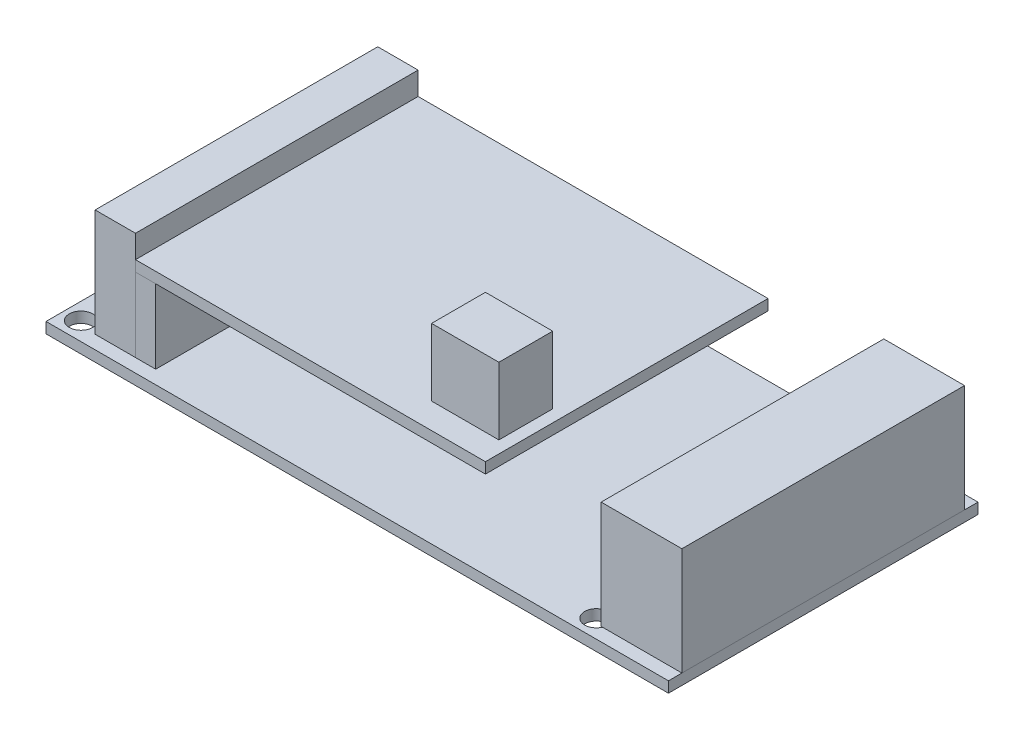
ISO-10303-21;
HEADER;
FILE_DESCRIPTION(('STEP AP214'),'2;1');
FILE_NAME('part.step','',(''),(''),'','','');
FILE_SCHEMA(('AUTOMOTIVE_DESIGN { 1 0 10303 214 1 1 1 1 }'));
ENDSEC;
DATA;
#1=APPLICATION_CONTEXT('core data for automotive mechanical design processes');
#2=APPLICATION_PROTOCOL_DEFINITION('international standard','automotive_design',2000,#1);
#3=PRODUCT_CONTEXT('',#1,'mechanical');
#4=PRODUCT('Part','Part','',(#3));
#5=PRODUCT_RELATED_PRODUCT_CATEGORY('part','',(#4));
#6=PRODUCT_DEFINITION_FORMATION('','',#4);
#7=PRODUCT_DEFINITION_CONTEXT('part definition',#1,'design');
#8=PRODUCT_DEFINITION('design','',#6,#7);
#9=PRODUCT_DEFINITION_SHAPE('','',#8);
#10=(LENGTH_UNIT() NAMED_UNIT(*) SI_UNIT(.MILLI.,.METRE.));
#11=(NAMED_UNIT(*) PLANE_ANGLE_UNIT() SI_UNIT($,.RADIAN.));
#12=(NAMED_UNIT(*) SI_UNIT($,.STERADIAN.) SOLID_ANGLE_UNIT());
#13=UNCERTAINTY_MEASURE_WITH_UNIT(LENGTH_MEASURE(1.E-05),#10,'distance_accuracy_value','');
#14=(GEOMETRIC_REPRESENTATION_CONTEXT(3) GLOBAL_UNCERTAINTY_ASSIGNED_CONTEXT((#13)) GLOBAL_UNIT_ASSIGNED_CONTEXT((#10,
#11,#12)) REPRESENTATION_CONTEXT('',''));
#15=CARTESIAN_POINT('',(0.,0.,0.));
#16=DIRECTION('',(0.,0.,1.));
#17=DIRECTION('',(1.,0.,0.));
#18=AXIS2_PLACEMENT_3D('',#15,#16,#17);
#19=CARTESIAN_POINT('',(5.25000000000003,24.2,9.2));
#20=DIRECTION('',(1.,0.,0.));
#21=DIRECTION('',(0.,0.,-1.));
#22=AXIS2_PLACEMENT_3D('',#19,#20,#21);
#23=PLANE('',#22);
#24=DIRECTION('',(0.,0.,1.));
#25=VECTOR('',#24,1.);
#26=CARTESIAN_POINT('',(5.25000000000003,14.2,9.2));
#27=LINE('',#26,#25);
#28=CARTESIAN_POINT('',(5.25000000000003,14.2,9.2));
#29=VERTEX_POINT('',#28);
#30=CARTESIAN_POINT('',(5.25000000000003,14.2,17.2));
#31=VERTEX_POINT('',#30);
#32=EDGE_CURVE('E113',#29,#31,#27,.T.);
#33=ORIENTED_EDGE('',*,*,#32,.T.);
#34=DIRECTION('',(0.,-1.,0.));
#35=VECTOR('',#34,1.);
#36=CARTESIAN_POINT('',(5.25000000000003,24.2,17.2));
#37=LINE('',#36,#35);
#38=CARTESIAN_POINT('',(5.25000000000003,24.2,17.2));
#39=VERTEX_POINT('',#38);
#40=EDGE_CURVE('E12',#39,#31,#37,.T.);
#41=ORIENTED_EDGE('',*,*,#40,.F.);
#42=DIRECTION('',(0.,0.,1.));
#43=VECTOR('',#42,1.);
#44=CARTESIAN_POINT('',(5.25000000000003,24.2,9.2));
#45=LINE('',#44,#43);
#46=CARTESIAN_POINT('',(5.25000000000003,24.2,9.2));
#47=VERTEX_POINT('',#46);
#48=EDGE_CURVE('E101',#47,#39,#45,.T.);
#49=ORIENTED_EDGE('',*,*,#48,.F.);
#50=DIRECTION('',(0.,-1.,0.));
#51=VECTOR('',#50,1.);
#52=CARTESIAN_POINT('',(5.25000000000003,24.2,9.2));
#53=LINE('',#52,#51);
#54=EDGE_CURVE('E109',#47,#29,#53,.T.);
#55=ORIENTED_EDGE('',*,*,#54,.T.);
#56=EDGE_LOOP('',(#33,#41,#49,#55));
#57=FACE_BOUND('',#56,.T.);
#58=ADVANCED_FACE('F50',(#57),#23,.F.);
#59=CARTESIAN_POINT('',(5.25000000000003,24.2,17.2));
#60=DIRECTION('',(0.,0.,-1.));
#61=DIRECTION('',(-1.,0.,0.));
#62=AXIS2_PLACEMENT_3D('',#59,#60,#61);
#63=PLANE('',#62);
#64=DIRECTION('',(1.,0.,0.));
#65=VECTOR('',#64,1.);
#66=CARTESIAN_POINT('',(5.25000000000003,14.2,17.2));
#67=LINE('',#66,#65);
#68=CARTESIAN_POINT('',(15.25,14.2,17.2));
#69=VERTEX_POINT('',#68);
#70=EDGE_CURVE('E105',#31,#69,#67,.T.);
#71=ORIENTED_EDGE('',*,*,#70,.T.);
#72=DIRECTION('',(0.,-1.,0.));
#73=VECTOR('',#72,1.);
#74=CARTESIAN_POINT('',(15.25,24.2,17.2));
#75=LINE('',#74,#73);
#76=CARTESIAN_POINT('',(15.25,24.2,17.2));
#77=VERTEX_POINT('',#76);
#78=EDGE_CURVE('E58',#77,#69,#75,.T.);
#79=ORIENTED_EDGE('',*,*,#78,.F.);
#80=DIRECTION('',(1.,0.,0.));
#81=VECTOR('',#80,1.);
#82=CARTESIAN_POINT('',(5.25000000000003,24.2,17.2));
#83=LINE('',#82,#81);
#84=EDGE_CURVE('E96',#39,#77,#83,.T.);
#85=ORIENTED_EDGE('',*,*,#84,.F.);
#86=ORIENTED_EDGE('',*,*,#40,.T.);
#87=EDGE_LOOP('',(#71,#79,#85,#86));
#88=FACE_BOUND('',#87,.T.);
#89=ADVANCED_FACE('F104',(#88),#63,.F.);
#90=CARTESIAN_POINT('',(15.25,24.2,9.2));
#91=DIRECTION('',(-1.,0.,0.));
#92=DIRECTION('',(0.,0.,1.));
#93=AXIS2_PLACEMENT_3D('',#90,#91,#92);
#94=PLANE('',#93);
#95=DIRECTION('',(0.,0.,-1.));
#96=VECTOR('',#95,1.);
#97=CARTESIAN_POINT('',(15.25,14.2,9.2));
#98=LINE('',#97,#96);
#99=CARTESIAN_POINT('',(15.25,14.2,9.2));
#100=VERTEX_POINT('',#99);
#101=EDGE_CURVE('E83',#69,#100,#98,.T.);
#102=ORIENTED_EDGE('',*,*,#101,.T.);
#103=DIRECTION('',(0.,-1.,0.));
#104=VECTOR('',#103,1.);
#105=CARTESIAN_POINT('',(15.25,24.2,9.2));
#106=LINE('',#105,#104);
#107=CARTESIAN_POINT('',(15.25,24.2,9.2));
#108=VERTEX_POINT('',#107);
#109=EDGE_CURVE('E106',#108,#100,#106,.T.);
#110=ORIENTED_EDGE('',*,*,#109,.F.);
#111=DIRECTION('',(0.,0.,-1.));
#112=VECTOR('',#111,1.);
#113=CARTESIAN_POINT('',(15.25,24.2,9.2));
#114=LINE('',#113,#112);
#115=EDGE_CURVE('E99',#77,#108,#114,.T.);
#116=ORIENTED_EDGE('',*,*,#115,.F.);
#117=ORIENTED_EDGE('',*,*,#78,.T.);
#118=EDGE_LOOP('',(#102,#110,#116,#117));
#119=FACE_BOUND('',#118,.T.);
#120=ADVANCED_FACE('F107',(#119),#94,.F.);
#121=CARTESIAN_POINT('',(5.25000000000003,24.2,9.2));
#122=DIRECTION('',(0.,0.,1.));
#123=DIRECTION('',(1.,0.,0.));
#124=AXIS2_PLACEMENT_3D('',#121,#122,#123);
#125=PLANE('',#124);
#126=DIRECTION('',(-1.,0.,0.));
#127=VECTOR('',#126,1.);
#128=CARTESIAN_POINT('',(5.25000000000003,14.2,9.2));
#129=LINE('',#128,#127);
#130=EDGE_CURVE('E89',#100,#29,#129,.T.);
#131=ORIENTED_EDGE('',*,*,#130,.T.);
#132=ORIENTED_EDGE('',*,*,#54,.F.);
#133=DIRECTION('',(-1.,0.,0.));
#134=VECTOR('',#133,1.);
#135=CARTESIAN_POINT('',(5.25000000000003,24.2,9.2));
#136=LINE('',#135,#134);
#137=EDGE_CURVE('E66',#108,#47,#136,.T.);
#138=ORIENTED_EDGE('',*,*,#137,.F.);
#139=ORIENTED_EDGE('',*,*,#109,.T.);
#140=EDGE_LOOP('',(#131,#132,#138,#139));
#141=FACE_BOUND('',#140,.T.);
#142=ADVANCED_FACE('F120',(#141),#125,.F.);
#143=CARTESIAN_POINT('',(0.,24.2,0.));
#144=DIRECTION('',(0.,1.,0.));
#145=DIRECTION('',(0.,0.,1.));
#146=AXIS2_PLACEMENT_3D('',#143,#144,#145);
#147=PLANE('',#146);
#148=ORIENTED_EDGE('',*,*,#48,.T.);
#149=ORIENTED_EDGE('',*,*,#84,.T.);
#150=ORIENTED_EDGE('',*,*,#115,.T.);
#151=ORIENTED_EDGE('',*,*,#137,.T.);
#152=EDGE_LOOP('',(#148,#149,#150,#151));
#153=FACE_BOUND('',#152,.T.);
#154=ADVANCED_FACE('F97',(#153),#147,.T.);
#155=CARTESIAN_POINT('',(0.,14.2,0.));
#156=DIRECTION('',(0.,1.,0.));
#157=DIRECTION('',(0.,0.,1.));
#158=AXIS2_PLACEMENT_3D('',#155,#156,#157);
#159=PLANE('',#158);
#160=ORIENTED_EDGE('',*,*,#32,.F.);
#161=ORIENTED_EDGE('',*,*,#130,.F.);
#162=ORIENTED_EDGE('',*,*,#101,.F.);
#163=ORIENTED_EDGE('',*,*,#70,.F.);
#164=EDGE_LOOP('',(#160,#161,#162,#163));
#165=FACE_BOUND('',#164,.T.);
#166=ADVANCED_FACE('F123',(#165),#159,.F.);
#167=CLOSED_SHELL('',(#58,#89,#120,#142,#154,#166));
#168=MANIFOLD_SOLID_BREP('B2',#167);
#169=CARTESIAN_POINT('',(-34.95,14.2,-21.));
#170=DIRECTION('',(1.,0.,0.));
#171=DIRECTION('',(0.,0.,-1.));
#172=AXIS2_PLACEMENT_3D('',#169,#170,#171);
#173=PLANE('',#172);
#174=DIRECTION('',(0.,0.,1.));
#175=VECTOR('',#174,1.);
#176=CARTESIAN_POINT('',(-34.95,12.6,-21.));
#177=LINE('',#176,#175);
#178=CARTESIAN_POINT('',(-34.95,12.6,-21.));
#179=VERTEX_POINT('',#178);
#180=CARTESIAN_POINT('',(-34.95,12.6,21.));
#181=VERTEX_POINT('',#180);
#182=EDGE_CURVE('E247',#179,#181,#177,.T.);
#183=ORIENTED_EDGE('',*,*,#182,.T.);
#184=DIRECTION('',(0.,-1.,0.));
#185=VECTOR('',#184,1.);
#186=CARTESIAN_POINT('',(-34.95,14.2,21.));
#187=LINE('',#186,#185);
#188=CARTESIAN_POINT('',(-34.95,14.2,21.));
#189=VERTEX_POINT('',#188);
#190=EDGE_CURVE('E48',#189,#181,#187,.T.);
#191=ORIENTED_EDGE('',*,*,#190,.F.);
#192=DIRECTION('',(0.,0.,1.));
#193=VECTOR('',#192,1.);
#194=CARTESIAN_POINT('',(-34.95,14.2,-21.));
#195=LINE('',#194,#193);
#196=CARTESIAN_POINT('',(-34.95,14.2,-21.));
#197=VERTEX_POINT('',#196);
#198=EDGE_CURVE('E235',#197,#189,#195,.T.);
#199=ORIENTED_EDGE('',*,*,#198,.F.);
#200=DIRECTION('',(0.,-1.,0.));
#201=VECTOR('',#200,1.);
#202=CARTESIAN_POINT('',(-34.95,14.2,-21.));
#203=LINE('',#202,#201);
#204=EDGE_CURVE('E243',#197,#179,#203,.T.);
#205=ORIENTED_EDGE('',*,*,#204,.T.);
#206=EDGE_LOOP('',(#183,#191,#199,#205));
#207=FACE_BOUND('',#206,.T.);
#208=ADVANCED_FACE('F184',(#207),#173,.F.);
#209=CARTESIAN_POINT('',(-34.95,14.2,21.));
#210=DIRECTION('',(0.,0.,-1.));
#211=DIRECTION('',(-1.,0.,0.));
#212=AXIS2_PLACEMENT_3D('',#209,#210,#211);
#213=PLANE('',#212);
#214=DIRECTION('',(1.,0.,0.));
#215=VECTOR('',#214,1.);
#216=CARTESIAN_POINT('',(-34.95,12.6,21.));
#217=LINE('',#216,#215);
#218=CARTESIAN_POINT('',(17.05,12.6,21.));
#219=VERTEX_POINT('',#218);
#220=EDGE_CURVE('E239',#181,#219,#217,.T.);
#221=ORIENTED_EDGE('',*,*,#220,.T.);
#222=DIRECTION('',(0.,-1.,0.));
#223=VECTOR('',#222,1.);
#224=CARTESIAN_POINT('',(17.05,14.2,21.));
#225=LINE('',#224,#223);
#226=CARTESIAN_POINT('',(17.05,14.2,21.));
#227=VERTEX_POINT('',#226);
#228=EDGE_CURVE('E192',#227,#219,#225,.T.);
#229=ORIENTED_EDGE('',*,*,#228,.F.);
#230=DIRECTION('',(1.,0.,0.));
#231=VECTOR('',#230,1.);
#232=CARTESIAN_POINT('',(-34.95,14.2,21.));
#233=LINE('',#232,#231);
#234=EDGE_CURVE('E230',#189,#227,#233,.T.);
#235=ORIENTED_EDGE('',*,*,#234,.F.);
#236=ORIENTED_EDGE('',*,*,#190,.T.);
#237=EDGE_LOOP('',(#221,#229,#235,#236));
#238=FACE_BOUND('',#237,.T.);
#239=ADVANCED_FACE('F238',(#238),#213,.F.);
#240=CARTESIAN_POINT('',(17.05,14.2,-21.));
#241=DIRECTION('',(-1.,0.,0.));
#242=DIRECTION('',(0.,0.,1.));
#243=AXIS2_PLACEMENT_3D('',#240,#241,#242);
#244=PLANE('',#243);
#245=DIRECTION('',(0.,0.,-1.));
#246=VECTOR('',#245,1.);
#247=CARTESIAN_POINT('',(17.05,12.6,-21.));
#248=LINE('',#247,#246);
#249=CARTESIAN_POINT('',(17.05,12.6,-21.));
#250=VERTEX_POINT('',#249);
#251=EDGE_CURVE('E217',#219,#250,#248,.T.);
#252=ORIENTED_EDGE('',*,*,#251,.T.);
#253=DIRECTION('',(0.,-1.,0.));
#254=VECTOR('',#253,1.);
#255=CARTESIAN_POINT('',(17.05,14.2,-21.));
#256=LINE('',#255,#254);
#257=CARTESIAN_POINT('',(17.05,14.2,-21.));
#258=VERTEX_POINT('',#257);
#259=EDGE_CURVE('E240',#258,#250,#256,.T.);
#260=ORIENTED_EDGE('',*,*,#259,.F.);
#261=DIRECTION('',(0.,0.,-1.));
#262=VECTOR('',#261,1.);
#263=CARTESIAN_POINT('',(17.05,14.2,-21.));
#264=LINE('',#263,#262);
#265=EDGE_CURVE('E233',#227,#258,#264,.T.);
#266=ORIENTED_EDGE('',*,*,#265,.F.);
#267=ORIENTED_EDGE('',*,*,#228,.T.);
#268=EDGE_LOOP('',(#252,#260,#266,#267));
#269=FACE_BOUND('',#268,.T.);
#270=ADVANCED_FACE('F241',(#269),#244,.F.);
#271=CARTESIAN_POINT('',(-34.95,14.2,-21.));
#272=DIRECTION('',(0.,0.,1.));
#273=DIRECTION('',(1.,0.,0.));
#274=AXIS2_PLACEMENT_3D('',#271,#272,#273);
#275=PLANE('',#274);
#276=DIRECTION('',(-1.,0.,0.));
#277=VECTOR('',#276,1.);
#278=CARTESIAN_POINT('',(-34.95,12.6,-21.));
#279=LINE('',#278,#277);
#280=EDGE_CURVE('E223',#250,#179,#279,.T.);
#281=ORIENTED_EDGE('',*,*,#280,.T.);
#282=ORIENTED_EDGE('',*,*,#204,.F.);
#283=DIRECTION('',(-1.,0.,0.));
#284=VECTOR('',#283,1.);
#285=CARTESIAN_POINT('',(-34.95,14.2,-21.));
#286=LINE('',#285,#284);
#287=EDGE_CURVE('E200',#258,#197,#286,.T.);
#288=ORIENTED_EDGE('',*,*,#287,.F.);
#289=ORIENTED_EDGE('',*,*,#259,.T.);
#290=EDGE_LOOP('',(#281,#282,#288,#289));
#291=FACE_BOUND('',#290,.T.);
#292=ADVANCED_FACE('F254',(#291),#275,.F.);
#293=CARTESIAN_POINT('',(0.,14.2,0.));
#294=DIRECTION('',(0.,1.,0.));
#295=DIRECTION('',(0.,0.,1.));
#296=AXIS2_PLACEMENT_3D('',#293,#294,#295);
#297=PLANE('',#296);
#298=ORIENTED_EDGE('',*,*,#198,.T.);
#299=ORIENTED_EDGE('',*,*,#234,.T.);
#300=ORIENTED_EDGE('',*,*,#265,.T.);
#301=ORIENTED_EDGE('',*,*,#287,.T.);
#302=EDGE_LOOP('',(#298,#299,#300,#301));
#303=FACE_BOUND('',#302,.T.);
#304=ADVANCED_FACE('F231',(#303),#297,.T.);
#305=CARTESIAN_POINT('',(0.,12.6,0.));
#306=DIRECTION('',(0.,1.,0.));
#307=DIRECTION('',(0.,0.,1.));
#308=AXIS2_PLACEMENT_3D('',#305,#306,#307);
#309=PLANE('',#308);
#310=ORIENTED_EDGE('',*,*,#182,.F.);
#311=ORIENTED_EDGE('',*,*,#280,.F.);
#312=ORIENTED_EDGE('',*,*,#251,.F.);
#313=ORIENTED_EDGE('',*,*,#220,.F.);
#314=EDGE_LOOP('',(#310,#311,#312,#313));
#315=FACE_BOUND('',#314,.T.);
#316=ADVANCED_FACE('F257',(#315),#309,.F.);
#317=CLOSED_SHELL('',(#208,#239,#270,#292,#304,#316));
#318=MANIFOLD_SOLID_BREP('B6',#317);
#319=CARTESIAN_POINT('',(-34.95,12.6,21.));
#320=DIRECTION('',(1.,0.,0.));
#321=DIRECTION('',(0.,0.,-1.));
#322=AXIS2_PLACEMENT_3D('',#319,#320,#321);
#323=PLANE('',#322);
#324=DIRECTION('',(0.,0.,1.));
#325=VECTOR('',#324,1.);
#326=CARTESIAN_POINT('',(-34.95,1.6,21.));
#327=LINE('',#326,#325);
#328=CARTESIAN_POINT('',(-34.95,1.6,-21.));
#329=VERTEX_POINT('',#328);
#330=CARTESIAN_POINT('',(-34.95,1.6,21.));
#331=VERTEX_POINT('',#330);
#332=EDGE_CURVE('E381',#329,#331,#327,.T.);
#333=ORIENTED_EDGE('',*,*,#332,.T.);
#334=DIRECTION('',(0.,-1.,0.));
#335=VECTOR('',#334,1.);
#336=CARTESIAN_POINT('',(-34.95,12.6,21.));
#337=LINE('',#336,#335);
#338=CARTESIAN_POINT('',(-34.95,12.6,21.));
#339=VERTEX_POINT('',#338);
#340=EDGE_CURVE('E182',#339,#331,#337,.T.);
#341=ORIENTED_EDGE('',*,*,#340,.F.);
#342=DIRECTION('',(0.,0.,1.));
#343=VECTOR('',#342,1.);
#344=CARTESIAN_POINT('',(-34.95,12.6,21.));
#345=LINE('',#344,#343);
#346=CARTESIAN_POINT('',(-34.95,12.6,-21.));
#347=VERTEX_POINT('',#346);
#348=EDGE_CURVE('E369',#347,#339,#345,.T.);
#349=ORIENTED_EDGE('',*,*,#348,.F.);
#350=DIRECTION('',(0.,-1.,0.));
#351=VECTOR('',#350,1.);
#352=CARTESIAN_POINT('',(-34.95,12.6,-21.));
#353=LINE('',#352,#351);
#354=EDGE_CURVE('E377',#347,#329,#353,.T.);
#355=ORIENTED_EDGE('',*,*,#354,.T.);
#356=EDGE_LOOP('',(#333,#341,#349,#355));
#357=FACE_BOUND('',#356,.T.);
#358=ADVANCED_FACE('F318',(#357),#323,.F.);
#359=CARTESIAN_POINT('',(-31.95,12.6,21.));
#360=DIRECTION('',(0.,0.,-1.));
#361=DIRECTION('',(-1.,0.,0.));
#362=AXIS2_PLACEMENT_3D('',#359,#360,#361);
#363=PLANE('',#362);
#364=DIRECTION('',(1.,0.,0.));
#365=VECTOR('',#364,1.);
#366=CARTESIAN_POINT('',(-31.95,1.6,21.));
#367=LINE('',#366,#365);
#368=CARTESIAN_POINT('',(-31.95,1.6,21.));
#369=VERTEX_POINT('',#368);
#370=EDGE_CURVE('E373',#331,#369,#367,.T.);
#371=ORIENTED_EDGE('',*,*,#370,.T.);
#372=DIRECTION('',(0.,-1.,0.));
#373=VECTOR('',#372,1.);
#374=CARTESIAN_POINT('',(-31.95,12.6,21.));
#375=LINE('',#374,#373);
#376=CARTESIAN_POINT('',(-31.95,12.6,21.));
#377=VERTEX_POINT('',#376);
#378=EDGE_CURVE('E326',#377,#369,#375,.T.);
#379=ORIENTED_EDGE('',*,*,#378,.F.);
#380=DIRECTION('',(1.,0.,0.));
#381=VECTOR('',#380,1.);
#382=CARTESIAN_POINT('',(-31.95,12.6,21.));
#383=LINE('',#382,#381);
#384=EDGE_CURVE('E364',#339,#377,#383,.T.);
#385=ORIENTED_EDGE('',*,*,#384,.F.);
#386=ORIENTED_EDGE('',*,*,#340,.T.);
#387=EDGE_LOOP('',(#371,#379,#385,#386));
#388=FACE_BOUND('',#387,.T.);
#389=ADVANCED_FACE('F372',(#388),#363,.F.);
#390=CARTESIAN_POINT('',(-31.95,12.6,21.));
#391=DIRECTION('',(-1.,0.,0.));
#392=DIRECTION('',(0.,0.,1.));
#393=AXIS2_PLACEMENT_3D('',#390,#391,#392);
#394=PLANE('',#393);
#395=DIRECTION('',(0.,0.,-1.));
#396=VECTOR('',#395,1.);
#397=CARTESIAN_POINT('',(-31.95,1.6,21.));
#398=LINE('',#397,#396);
#399=CARTESIAN_POINT('',(-31.95,1.6,-21.));
#400=VERTEX_POINT('',#399);
#401=EDGE_CURVE('E351',#369,#400,#398,.T.);
#402=ORIENTED_EDGE('',*,*,#401,.T.);
#403=DIRECTION('',(0.,-1.,0.));
#404=VECTOR('',#403,1.);
#405=CARTESIAN_POINT('',(-31.95,12.6,-21.));
#406=LINE('',#405,#404);
#407=CARTESIAN_POINT('',(-31.95,12.6,-21.));
#408=VERTEX_POINT('',#407);
#409=EDGE_CURVE('E374',#408,#400,#406,.T.);
#410=ORIENTED_EDGE('',*,*,#409,.F.);
#411=DIRECTION('',(0.,0.,-1.));
#412=VECTOR('',#411,1.);
#413=CARTESIAN_POINT('',(-31.95,12.6,21.));
#414=LINE('',#413,#412);
#415=EDGE_CURVE('E367',#377,#408,#414,.T.);
#416=ORIENTED_EDGE('',*,*,#415,.F.);
#417=ORIENTED_EDGE('',*,*,#378,.T.);
#418=EDGE_LOOP('',(#402,#410,#416,#417));
#419=FACE_BOUND('',#418,.T.);
#420=ADVANCED_FACE('F375',(#419),#394,.F.);
#421=CARTESIAN_POINT('',(-31.95,12.6,-21.));
#422=DIRECTION('',(0.,0.,1.));
#423=DIRECTION('',(1.,0.,0.));
#424=AXIS2_PLACEMENT_3D('',#421,#422,#423);
#425=PLANE('',#424);
#426=DIRECTION('',(-1.,0.,0.));
#427=VECTOR('',#426,1.);
#428=CARTESIAN_POINT('',(-31.95,1.6,-21.));
#429=LINE('',#428,#427);
#430=EDGE_CURVE('E357',#400,#329,#429,.T.);
#431=ORIENTED_EDGE('',*,*,#430,.T.);
#432=ORIENTED_EDGE('',*,*,#354,.F.);
#433=DIRECTION('',(-1.,0.,0.));
#434=VECTOR('',#433,1.);
#435=CARTESIAN_POINT('',(-31.95,12.6,-21.));
#436=LINE('',#435,#434);
#437=EDGE_CURVE('E334',#408,#347,#436,.T.);
#438=ORIENTED_EDGE('',*,*,#437,.F.);
#439=ORIENTED_EDGE('',*,*,#409,.T.);
#440=EDGE_LOOP('',(#431,#432,#438,#439));
#441=FACE_BOUND('',#440,.T.);
#442=ADVANCED_FACE('F388',(#441),#425,.F.);
#443=CARTESIAN_POINT('',(0.,12.6,0.));
#444=DIRECTION('',(0.,1.,0.));
#445=DIRECTION('',(0.,0.,1.));
#446=AXIS2_PLACEMENT_3D('',#443,#444,#445);
#447=PLANE('',#446);
#448=ORIENTED_EDGE('',*,*,#348,.T.);
#449=ORIENTED_EDGE('',*,*,#384,.T.);
#450=ORIENTED_EDGE('',*,*,#415,.T.);
#451=ORIENTED_EDGE('',*,*,#437,.T.);
#452=EDGE_LOOP('',(#448,#449,#450,#451));
#453=FACE_BOUND('',#452,.T.);
#454=ADVANCED_FACE('F365',(#453),#447,.T.);
#455=CARTESIAN_POINT('',(0.,1.6,0.));
#456=DIRECTION('',(0.,1.,0.));
#457=DIRECTION('',(0.,0.,1.));
#458=AXIS2_PLACEMENT_3D('',#455,#456,#457);
#459=PLANE('',#458);
#460=ORIENTED_EDGE('',*,*,#332,.F.);
#461=ORIENTED_EDGE('',*,*,#430,.F.);
#462=ORIENTED_EDGE('',*,*,#401,.F.);
#463=ORIENTED_EDGE('',*,*,#370,.F.);
#464=EDGE_LOOP('',(#460,#461,#462,#463));
#465=FACE_BOUND('',#464,.T.);
#466=ADVANCED_FACE('F391',(#465),#459,.F.);
#467=CLOSED_SHELL('',(#358,#389,#420,#442,#454,#466));
#468=MANIFOLD_SOLID_BREP('B42',#467);
#469=CARTESIAN_POINT('',(46.25,17.6,21.));
#470=DIRECTION('',(-1.,0.,0.));
#471=DIRECTION('',(0.,0.,1.));
#472=AXIS2_PLACEMENT_3D('',#469,#470,#471);
#473=PLANE('',#472);
#474=DIRECTION('',(0.,0.,-1.));
#475=VECTOR('',#474,1.);
#476=CARTESIAN_POINT('',(46.25,1.6,21.));
#477=LINE('',#476,#475);
#478=CARTESIAN_POINT('',(46.25,1.6,21.));
#479=VERTEX_POINT('',#478);
#480=CARTESIAN_POINT('',(46.25,1.6,-21.));
#481=VERTEX_POINT('',#480);
#482=EDGE_CURVE('E515',#479,#481,#477,.T.);
#483=ORIENTED_EDGE('',*,*,#482,.T.);
#484=DIRECTION('',(0.,-1.,0.));
#485=VECTOR('',#484,1.);
#486=CARTESIAN_POINT('',(46.25,17.6,-21.));
#487=LINE('',#486,#485);
#488=CARTESIAN_POINT('',(46.25,17.6,-21.));
#489=VERTEX_POINT('',#488);
#490=EDGE_CURVE('E316',#489,#481,#487,.T.);
#491=ORIENTED_EDGE('',*,*,#490,.F.);
#492=DIRECTION('',(0.,0.,-1.));
#493=VECTOR('',#492,1.);
#494=CARTESIAN_POINT('',(46.25,17.6,21.));
#495=LINE('',#494,#493);
#496=CARTESIAN_POINT('',(46.25,17.6,21.));
#497=VERTEX_POINT('',#496);
#498=EDGE_CURVE('E503',#497,#489,#495,.T.);
#499=ORIENTED_EDGE('',*,*,#498,.F.);
#500=DIRECTION('',(0.,-1.,0.));
#501=VECTOR('',#500,1.);
#502=CARTESIAN_POINT('',(46.25,17.6,21.));
#503=LINE('',#502,#501);
#504=EDGE_CURVE('E511',#497,#479,#503,.T.);
#505=ORIENTED_EDGE('',*,*,#504,.T.);
#506=EDGE_LOOP('',(#483,#491,#499,#505));
#507=FACE_BOUND('',#506,.T.);
#508=ADVANCED_FACE('F452',(#507),#473,.F.);
#509=CARTESIAN_POINT('',(34.25,17.6,-21.));
#510=DIRECTION('',(0.,0.,1.));
#511=DIRECTION('',(1.,0.,0.));
#512=AXIS2_PLACEMENT_3D('',#509,#510,#511);
#513=PLANE('',#512);
#514=DIRECTION('',(-1.,0.,0.));
#515=VECTOR('',#514,1.);
#516=CARTESIAN_POINT('',(34.25,1.6,-21.));
#517=LINE('',#516,#515);
#518=CARTESIAN_POINT('',(34.25,1.6,-21.));
#519=VERTEX_POINT('',#518);
#520=EDGE_CURVE('E507',#481,#519,#517,.T.);
#521=ORIENTED_EDGE('',*,*,#520,.T.);
#522=DIRECTION('',(0.,-1.,0.));
#523=VECTOR('',#522,1.);
#524=CARTESIAN_POINT('',(34.25,17.6,-21.));
#525=LINE('',#524,#523);
#526=CARTESIAN_POINT('',(34.25,17.6,-21.));
#527=VERTEX_POINT('',#526);
#528=EDGE_CURVE('E460',#527,#519,#525,.T.);
#529=ORIENTED_EDGE('',*,*,#528,.F.);
#530=DIRECTION('',(-1.,0.,0.));
#531=VECTOR('',#530,1.);
#532=CARTESIAN_POINT('',(34.25,17.6,-21.));
#533=LINE('',#532,#531);
#534=EDGE_CURVE('E498',#489,#527,#533,.T.);
#535=ORIENTED_EDGE('',*,*,#534,.F.);
#536=ORIENTED_EDGE('',*,*,#490,.T.);
#537=EDGE_LOOP('',(#521,#529,#535,#536));
#538=FACE_BOUND('',#537,.T.);
#539=ADVANCED_FACE('F506',(#538),#513,.F.);
#540=CARTESIAN_POINT('',(34.25,17.6,21.));
#541=DIRECTION('',(1.,0.,0.));
#542=DIRECTION('',(0.,0.,-1.));
#543=AXIS2_PLACEMENT_3D('',#540,#541,#542);
#544=PLANE('',#543);
#545=DIRECTION('',(0.,0.,1.));
#546=VECTOR('',#545,1.);
#547=CARTESIAN_POINT('',(34.25,1.6,21.));
#548=LINE('',#547,#546);
#549=CARTESIAN_POINT('',(34.25,1.6,21.));
#550=VERTEX_POINT('',#549);
#551=EDGE_CURVE('E485',#519,#550,#548,.T.);
#552=ORIENTED_EDGE('',*,*,#551,.T.);
#553=DIRECTION('',(0.,-1.,0.));
#554=VECTOR('',#553,1.);
#555=CARTESIAN_POINT('',(34.25,17.6,21.));
#556=LINE('',#555,#554);
#557=CARTESIAN_POINT('',(34.25,17.6,21.));
#558=VERTEX_POINT('',#557);
#559=EDGE_CURVE('E508',#558,#550,#556,.T.);
#560=ORIENTED_EDGE('',*,*,#559,.F.);
#561=DIRECTION('',(0.,0.,1.));
#562=VECTOR('',#561,1.);
#563=CARTESIAN_POINT('',(34.25,17.6,21.));
#564=LINE('',#563,#562);
#565=EDGE_CURVE('E501',#527,#558,#564,.T.);
#566=ORIENTED_EDGE('',*,*,#565,.F.);
#567=ORIENTED_EDGE('',*,*,#528,.T.);
#568=EDGE_LOOP('',(#552,#560,#566,#567));
#569=FACE_BOUND('',#568,.T.);
#570=ADVANCED_FACE('F509',(#569),#544,.F.);
#571=CARTESIAN_POINT('',(34.25,17.6,21.));
#572=DIRECTION('',(0.,0.,-1.));
#573=DIRECTION('',(-1.,0.,0.));
#574=AXIS2_PLACEMENT_3D('',#571,#572,#573);
#575=PLANE('',#574);
#576=DIRECTION('',(1.,0.,0.));
#577=VECTOR('',#576,1.);
#578=CARTESIAN_POINT('',(34.25,1.6,21.));
#579=LINE('',#578,#577);
#580=EDGE_CURVE('E491',#550,#479,#579,.T.);
#581=ORIENTED_EDGE('',*,*,#580,.T.);
#582=ORIENTED_EDGE('',*,*,#504,.F.);
#583=DIRECTION('',(1.,0.,0.));
#584=VECTOR('',#583,1.);
#585=CARTESIAN_POINT('',(34.25,17.6,21.));
#586=LINE('',#585,#584);
#587=EDGE_CURVE('E468',#558,#497,#586,.T.);
#588=ORIENTED_EDGE('',*,*,#587,.F.);
#589=ORIENTED_EDGE('',*,*,#559,.T.);
#590=EDGE_LOOP('',(#581,#582,#588,#589));
#591=FACE_BOUND('',#590,.T.);
#592=ADVANCED_FACE('F522',(#591),#575,.F.);
#593=CARTESIAN_POINT('',(0.,17.6,0.));
#594=DIRECTION('',(0.,-1.,0.));
#595=DIRECTION('',(0.,0.,-1.));
#596=AXIS2_PLACEMENT_3D('',#593,#594,#595);
#597=PLANE('',#596);
#598=ORIENTED_EDGE('',*,*,#498,.T.);
#599=ORIENTED_EDGE('',*,*,#534,.T.);
#600=ORIENTED_EDGE('',*,*,#565,.T.);
#601=ORIENTED_EDGE('',*,*,#587,.T.);
#602=EDGE_LOOP('',(#598,#599,#600,#601));
#603=FACE_BOUND('',#602,.T.);
#604=ADVANCED_FACE('F499',(#603),#597,.F.);
#605=CARTESIAN_POINT('',(0.,1.6,0.));
#606=DIRECTION('',(0.,-1.,0.));
#607=DIRECTION('',(0.,0.,-1.));
#608=AXIS2_PLACEMENT_3D('',#605,#606,#607);
#609=PLANE('',#608);
#610=ORIENTED_EDGE('',*,*,#482,.F.);
#611=ORIENTED_EDGE('',*,*,#580,.F.);
#612=ORIENTED_EDGE('',*,*,#551,.F.);
#613=ORIENTED_EDGE('',*,*,#520,.F.);
#614=EDGE_LOOP('',(#610,#611,#612,#613));
#615=FACE_BOUND('',#614,.T.);
#616=ADVANCED_FACE('F525',(#615),#609,.T.);
#617=CLOSED_SHELL('',(#508,#539,#570,#592,#604,#616));
#618=MANIFOLD_SOLID_BREP('B176',#617);
#619=CARTESIAN_POINT('',(-40.95,17.6,-21.));
#620=DIRECTION('',(1.,0.,0.));
#621=DIRECTION('',(0.,0.,-1.));
#622=AXIS2_PLACEMENT_3D('',#619,#620,#621);
#623=PLANE('',#622);
#624=DIRECTION('',(0.,0.,1.));
#625=VECTOR('',#624,1.);
#626=CARTESIAN_POINT('',(-40.95,1.6,-21.));
#627=LINE('',#626,#625);
#628=CARTESIAN_POINT('',(-40.95,1.6,-21.));
#629=VERTEX_POINT('',#628);
#630=CARTESIAN_POINT('',(-40.95,1.6,21.));
#631=VERTEX_POINT('',#630);
#632=EDGE_CURVE('E648',#629,#631,#627,.T.);
#633=ORIENTED_EDGE('',*,*,#632,.T.);
#634=DIRECTION('',(0.,-1.,0.));
#635=VECTOR('',#634,1.);
#636=CARTESIAN_POINT('',(-40.95,17.6,21.));
#637=LINE('',#636,#635);
#638=CARTESIAN_POINT('',(-40.95,17.6,21.));
#639=VERTEX_POINT('',#638);
#640=EDGE_CURVE('E450',#639,#631,#637,.T.);
#641=ORIENTED_EDGE('',*,*,#640,.F.);
#642=DIRECTION('',(0.,0.,1.));
#643=VECTOR('',#642,1.);
#644=CARTESIAN_POINT('',(-40.95,17.6,-21.));
#645=LINE('',#644,#643);
#646=CARTESIAN_POINT('',(-40.95,17.6,-21.));
#647=VERTEX_POINT('',#646);
#648=EDGE_CURVE('E636',#647,#639,#645,.T.);
#649=ORIENTED_EDGE('',*,*,#648,.F.);
#650=DIRECTION('',(0.,-1.,0.));
#651=VECTOR('',#650,1.);
#652=CARTESIAN_POINT('',(-40.95,17.6,-21.));
#653=LINE('',#652,#651);
#654=EDGE_CURVE('E644',#647,#629,#653,.T.);
#655=ORIENTED_EDGE('',*,*,#654,.T.);
#656=EDGE_LOOP('',(#633,#641,#649,#655));
#657=FACE_BOUND('',#656,.T.);
#658=ADVANCED_FACE('F585',(#657),#623,.F.);
#659=CARTESIAN_POINT('',(-34.95,17.6,21.));
#660=DIRECTION('',(0.,0.,-1.));
#661=DIRECTION('',(-1.,0.,0.));
#662=AXIS2_PLACEMENT_3D('',#659,#660,#661);
#663=PLANE('',#662);
#664=DIRECTION('',(1.,0.,0.));
#665=VECTOR('',#664,1.);
#666=CARTESIAN_POINT('',(-34.95,1.6,21.));
#667=LINE('',#666,#665);
#668=CARTESIAN_POINT('',(-34.95,1.6,21.));
#669=VERTEX_POINT('',#668);
#670=EDGE_CURVE('E640',#631,#669,#667,.T.);
#671=ORIENTED_EDGE('',*,*,#670,.T.);
#672=DIRECTION('',(0.,-1.,0.));
#673=VECTOR('',#672,1.);
#674=CARTESIAN_POINT('',(-34.95,17.6,21.));
#675=LINE('',#674,#673);
#676=CARTESIAN_POINT('',(-34.95,17.6,21.));
#677=VERTEX_POINT('',#676);
#678=EDGE_CURVE('E593',#677,#669,#675,.T.);
#679=ORIENTED_EDGE('',*,*,#678,.F.);
#680=DIRECTION('',(1.,0.,0.));
#681=VECTOR('',#680,1.);
#682=CARTESIAN_POINT('',(-34.95,17.6,21.));
#683=LINE('',#682,#681);
#684=EDGE_CURVE('E631',#639,#677,#683,.T.);
#685=ORIENTED_EDGE('',*,*,#684,.F.);
#686=ORIENTED_EDGE('',*,*,#640,.T.);
#687=EDGE_LOOP('',(#671,#679,#685,#686));
#688=FACE_BOUND('',#687,.T.);
#689=ADVANCED_FACE('F639',(#688),#663,.F.);
#690=CARTESIAN_POINT('',(-34.95,17.6,-21.));
#691=DIRECTION('',(-1.,0.,0.));
#692=DIRECTION('',(0.,0.,1.));
#693=AXIS2_PLACEMENT_3D('',#690,#691,#692);
#694=PLANE('',#693);
#695=DIRECTION('',(0.,0.,-1.));
#696=VECTOR('',#695,1.);
#697=CARTESIAN_POINT('',(-34.95,1.6,-21.));
#698=LINE('',#697,#696);
#699=CARTESIAN_POINT('',(-34.95,1.6,-21.));
#700=VERTEX_POINT('',#699);
#701=EDGE_CURVE('E618',#669,#700,#698,.T.);
#702=ORIENTED_EDGE('',*,*,#701,.T.);
#703=DIRECTION('',(0.,-1.,0.));
#704=VECTOR('',#703,1.);
#705=CARTESIAN_POINT('',(-34.95,17.6,-21.));
#706=LINE('',#705,#704);
#707=CARTESIAN_POINT('',(-34.95,17.6,-21.));
#708=VERTEX_POINT('',#707);
#709=EDGE_CURVE('E641',#708,#700,#706,.T.);
#710=ORIENTED_EDGE('',*,*,#709,.F.);
#711=DIRECTION('',(0.,0.,-1.));
#712=VECTOR('',#711,1.);
#713=CARTESIAN_POINT('',(-34.95,17.6,-21.));
#714=LINE('',#713,#712);
#715=EDGE_CURVE('E634',#677,#708,#714,.T.);
#716=ORIENTED_EDGE('',*,*,#715,.F.);
#717=ORIENTED_EDGE('',*,*,#678,.T.);
#718=EDGE_LOOP('',(#702,#710,#716,#717));
#719=FACE_BOUND('',#718,.T.);
#720=ADVANCED_FACE('F642',(#719),#694,.F.);
#721=CARTESIAN_POINT('',(-34.95,17.6,-21.));
#722=DIRECTION('',(0.,0.,1.));
#723=DIRECTION('',(1.,0.,0.));
#724=AXIS2_PLACEMENT_3D('',#721,#722,#723);
#725=PLANE('',#724);
#726=DIRECTION('',(-1.,0.,0.));
#727=VECTOR('',#726,1.);
#728=CARTESIAN_POINT('',(-34.95,1.6,-21.));
#729=LINE('',#728,#727);
#730=EDGE_CURVE('E624',#700,#629,#729,.T.);
#731=ORIENTED_EDGE('',*,*,#730,.T.);
#732=ORIENTED_EDGE('',*,*,#654,.F.);
#733=DIRECTION('',(-1.,0.,0.));
#734=VECTOR('',#733,1.);
#735=CARTESIAN_POINT('',(-34.95,17.6,-21.));
#736=LINE('',#735,#734);
#737=EDGE_CURVE('E601',#708,#647,#736,.T.);
#738=ORIENTED_EDGE('',*,*,#737,.F.);
#739=ORIENTED_EDGE('',*,*,#709,.T.);
#740=EDGE_LOOP('',(#731,#732,#738,#739));
#741=FACE_BOUND('',#740,.T.);
#742=ADVANCED_FACE('F655',(#741),#725,.F.);
#743=CARTESIAN_POINT('',(0.,17.6,0.));
#744=DIRECTION('',(0.,-1.,0.));
#745=DIRECTION('',(0.,0.,-1.));
#746=AXIS2_PLACEMENT_3D('',#743,#744,#745);
#747=PLANE('',#746);
#748=ORIENTED_EDGE('',*,*,#648,.T.);
#749=ORIENTED_EDGE('',*,*,#684,.T.);
#750=ORIENTED_EDGE('',*,*,#715,.T.);
#751=ORIENTED_EDGE('',*,*,#737,.T.);
#752=EDGE_LOOP('',(#748,#749,#750,#751));
#753=FACE_BOUND('',#752,.T.);
#754=ADVANCED_FACE('F632',(#753),#747,.F.);
#755=CARTESIAN_POINT('',(0.,1.6,0.));
#756=DIRECTION('',(0.,-1.,0.));
#757=DIRECTION('',(0.,0.,-1.));
#758=AXIS2_PLACEMENT_3D('',#755,#756,#757);
#759=PLANE('',#758);
#760=ORIENTED_EDGE('',*,*,#632,.F.);
#761=ORIENTED_EDGE('',*,*,#730,.F.);
#762=ORIENTED_EDGE('',*,*,#701,.F.);
#763=ORIENTED_EDGE('',*,*,#670,.F.);
#764=EDGE_LOOP('',(#760,#761,#762,#763));
#765=FACE_BOUND('',#764,.T.);
#766=ADVANCED_FACE('F658',(#765),#759,.T.);
#767=CLOSED_SHELL('',(#658,#689,#720,#742,#754,#766));
#768=MANIFOLD_SOLID_BREP('B310',#767);
#769=CARTESIAN_POINT('',(-46.25,1.6,-23.));
#770=DIRECTION('',(1.,0.,0.));
#771=DIRECTION('',(0.,0.,-1.));
#772=AXIS2_PLACEMENT_3D('',#769,#770,#771);
#773=PLANE('',#772);
#774=DIRECTION('',(0.,0.,1.));
#775=VECTOR('',#774,1.);
#776=CARTESIAN_POINT('',(-46.25,0.,-23.));
#777=LINE('',#776,#775);
#778=CARTESIAN_POINT('',(-46.25,0.,-23.));
#779=VERTEX_POINT('',#778);
#780=CARTESIAN_POINT('',(-46.25,0.,23.));
#781=VERTEX_POINT('',#780);
#782=EDGE_CURVE('E772',#779,#781,#777,.T.);
#783=ORIENTED_EDGE('',*,*,#782,.T.);
#784=DIRECTION('',(0.,-1.,0.));
#785=VECTOR('',#784,1.);
#786=CARTESIAN_POINT('',(-46.25,1.6,23.));
#787=LINE('',#786,#785);
#788=CARTESIAN_POINT('',(-46.25,1.6,23.));
#789=VERTEX_POINT('',#788);
#790=EDGE_CURVE('E583',#789,#781,#787,.T.);
#791=ORIENTED_EDGE('',*,*,#790,.F.);
#792=DIRECTION('',(0.,0.,1.));
#793=VECTOR('',#792,1.);
#794=CARTESIAN_POINT('',(-46.25,1.6,-23.));
#795=LINE('',#794,#793);
#796=CARTESIAN_POINT('',(-46.25,1.6,-23.));
#797=VERTEX_POINT('',#796);
#798=EDGE_CURVE('E760',#797,#789,#795,.T.);
#799=ORIENTED_EDGE('',*,*,#798,.F.);
#800=DIRECTION('',(0.,-1.,0.));
#801=VECTOR('',#800,1.);
#802=CARTESIAN_POINT('',(-46.25,1.6,-23.));
#803=LINE('',#802,#801);
#804=EDGE_CURVE('E768',#797,#779,#803,.T.);
#805=ORIENTED_EDGE('',*,*,#804,.T.);
#806=EDGE_LOOP('',(#783,#791,#799,#805));
#807=FACE_BOUND('',#806,.T.);
#808=ADVANCED_FACE('F709',(#807),#773,.F.);
#809=CARTESIAN_POINT('',(46.25,1.6,23.));
#810=DIRECTION('',(0.,0.,-1.));
#811=DIRECTION('',(-1.,0.,0.));
#812=AXIS2_PLACEMENT_3D('',#809,#810,#811);
#813=PLANE('',#812);
#814=DIRECTION('',(1.,0.,0.));
#815=VECTOR('',#814,1.);
#816=CARTESIAN_POINT('',(46.25,0.,23.));
#817=LINE('',#816,#815);
#818=CARTESIAN_POINT('',(46.25,0.,23.));
#819=VERTEX_POINT('',#818);
#820=EDGE_CURVE('E764',#781,#819,#817,.T.);
#821=ORIENTED_EDGE('',*,*,#820,.T.);
#822=DIRECTION('',(0.,-1.,0.));
#823=VECTOR('',#822,1.);
#824=CARTESIAN_POINT('',(46.25,1.6,23.));
#825=LINE('',#824,#823);
#826=CARTESIAN_POINT('',(46.25,1.6,23.));
#827=VERTEX_POINT('',#826);
#828=EDGE_CURVE('E717',#827,#819,#825,.T.);
#829=ORIENTED_EDGE('',*,*,#828,.F.);
#830=DIRECTION('',(1.,0.,0.));
#831=VECTOR('',#830,1.);
#832=CARTESIAN_POINT('',(46.25,1.6,23.));
#833=LINE('',#832,#831);
#834=EDGE_CURVE('E755',#789,#827,#833,.T.);
#835=ORIENTED_EDGE('',*,*,#834,.F.);
#836=ORIENTED_EDGE('',*,*,#790,.T.);
#837=EDGE_LOOP('',(#821,#829,#835,#836));
#838=FACE_BOUND('',#837,.T.);
#839=ADVANCED_FACE('F763',(#838),#813,.F.);
#840=CARTESIAN_POINT('',(46.25,1.6,-23.));
#841=DIRECTION('',(-1.,0.,0.));
#842=DIRECTION('',(0.,0.,1.));
#843=AXIS2_PLACEMENT_3D('',#840,#841,#842);
#844=PLANE('',#843);
#845=DIRECTION('',(0.,0.,-1.));
#846=VECTOR('',#845,1.);
#847=CARTESIAN_POINT('',(46.25,0.,-23.));
#848=LINE('',#847,#846);
#849=CARTESIAN_POINT('',(46.25,0.,-23.));
#850=VERTEX_POINT('',#849);
#851=EDGE_CURVE('E742',#819,#850,#848,.T.);
#852=ORIENTED_EDGE('',*,*,#851,.T.);
#853=DIRECTION('',(0.,-1.,0.));
#854=VECTOR('',#853,1.);
#855=CARTESIAN_POINT('',(46.25,1.6,-23.));
#856=LINE('',#855,#854);
#857=CARTESIAN_POINT('',(46.25,1.6,-23.));
#858=VERTEX_POINT('',#857);
#859=EDGE_CURVE('E765',#858,#850,#856,.T.);
#860=ORIENTED_EDGE('',*,*,#859,.F.);
#861=DIRECTION('',(0.,0.,-1.));
#862=VECTOR('',#861,1.);
#863=CARTESIAN_POINT('',(46.25,1.6,-23.));
#864=LINE('',#863,#862);
#865=EDGE_CURVE('E758',#827,#858,#864,.T.);
#866=ORIENTED_EDGE('',*,*,#865,.F.);
#867=ORIENTED_EDGE('',*,*,#828,.T.);
#868=EDGE_LOOP('',(#852,#860,#866,#867));
#869=FACE_BOUND('',#868,.T.);
#870=ADVANCED_FACE('F766',(#869),#844,.F.);
#871=CARTESIAN_POINT('',(46.25,1.6,-23.));
#872=DIRECTION('',(0.,0.,1.));
#873=DIRECTION('',(1.,0.,0.));
#874=AXIS2_PLACEMENT_3D('',#871,#872,#873);
#875=PLANE('',#874);
#876=DIRECTION('',(-1.,0.,0.));
#877=VECTOR('',#876,1.);
#878=CARTESIAN_POINT('',(46.25,0.,-23.));
#879=LINE('',#878,#877);
#880=EDGE_CURVE('E748',#850,#779,#879,.T.);
#881=ORIENTED_EDGE('',*,*,#880,.T.);
#882=ORIENTED_EDGE('',*,*,#804,.F.);
#883=DIRECTION('',(-1.,0.,0.));
#884=VECTOR('',#883,1.);
#885=CARTESIAN_POINT('',(46.25,1.6,-23.));
#886=LINE('',#885,#884);
#887=EDGE_CURVE('E725',#858,#797,#886,.T.);
#888=ORIENTED_EDGE('',*,*,#887,.F.);
#889=ORIENTED_EDGE('',*,*,#859,.T.);
#890=EDGE_LOOP('',(#881,#882,#888,#889));
#891=FACE_BOUND('',#890,.T.);
#892=ADVANCED_FACE('F780',(#891),#875,.F.);
#893=CARTESIAN_POINT('',(0.,1.6,0.));
#894=DIRECTION('',(0.,-1.,0.));
#895=DIRECTION('',(0.,0.,-1.));
#896=AXIS2_PLACEMENT_3D('',#893,#894,#895);
#897=PLANE('',#896);
#898=CARTESIAN_POINT('',(-43.75,1.6,-20.3));
#899=DIRECTION('',(0.,1.,0.));
#900=DIRECTION('',(0.,0.,1.));
#901=AXIS2_PLACEMENT_3D('',#898,#899,#900);
#902=CIRCLE('',#901,1.74999999999999);
#903=CARTESIAN_POINT('',(-43.75,1.6,-18.55));
#904=VERTEX_POINT('',#903);
#905=EDGE_CURVE('E806',#904,#904,#902,.T.);
#906=ORIENTED_EDGE('',*,*,#905,.F.);
#907=EDGE_LOOP('',(#906));
#908=FACE_BOUND('',#907,.T.);
#909=CARTESIAN_POINT('',(-43.75,1.6,20.3));
#910=DIRECTION('',(0.,1.,0.));
#911=DIRECTION('',(0.,0.,1.));
#912=AXIS2_PLACEMENT_3D('',#909,#910,#911);
#913=CIRCLE('',#912,1.74999999999999);
#914=CARTESIAN_POINT('',(-43.75,1.6,22.05));
#915=VERTEX_POINT('',#914);
#916=EDGE_CURVE('E800',#915,#915,#913,.T.);
#917=ORIENTED_EDGE('',*,*,#916,.F.);
#918=EDGE_LOOP('',(#917));
#919=FACE_BOUND('',#918,.T.);
#920=CARTESIAN_POINT('',(32.85,1.6,20.3));
#921=DIRECTION('',(0.,1.,0.));
#922=DIRECTION('',(0.,0.,1.));
#923=AXIS2_PLACEMENT_3D('',#920,#921,#922);
#924=CIRCLE('',#923,1.74999999999999);
#925=CARTESIAN_POINT('',(32.85,1.6,22.05));
#926=VERTEX_POINT('',#925);
#927=EDGE_CURVE('E794',#926,#926,#924,.T.);
#928=ORIENTED_EDGE('',*,*,#927,.F.);
#929=EDGE_LOOP('',(#928));
#930=FACE_BOUND('',#929,.T.);
#931=CARTESIAN_POINT('',(32.85,1.6,-20.3));
#932=DIRECTION('',(0.,1.,0.));
#933=DIRECTION('',(0.,0.,1.));
#934=AXIS2_PLACEMENT_3D('',#931,#932,#933);
#935=CIRCLE('',#934,1.74999999999999);
#936=CARTESIAN_POINT('',(32.85,1.6,-18.55));
#937=VERTEX_POINT('',#936);
#938=EDGE_CURVE('E788',#937,#937,#935,.T.);
#939=ORIENTED_EDGE('',*,*,#938,.F.);
#940=EDGE_LOOP('',(#939));
#941=FACE_BOUND('',#940,.T.);
#942=ORIENTED_EDGE('',*,*,#798,.T.);
#943=ORIENTED_EDGE('',*,*,#834,.T.);
#944=ORIENTED_EDGE('',*,*,#865,.T.);
#945=ORIENTED_EDGE('',*,*,#887,.T.);
#946=EDGE_LOOP('',(#942,#943,#944,#945));
#947=FACE_BOUND('',#946,.T.);
#948=ADVANCED_FACE('F756',(#908,#919,#930,#941,#947),#897,.F.);
#949=CARTESIAN_POINT('',(0.,0.,0.));
#950=DIRECTION('',(0.,-1.,0.));
#951=DIRECTION('',(0.,0.,-1.));
#952=AXIS2_PLACEMENT_3D('',#949,#950,#951);
#953=PLANE('',#952);
#954=CARTESIAN_POINT('',(-43.75,0.,-20.3));
#955=DIRECTION('',(0.,1.,0.));
#956=DIRECTION('',(0.,0.,1.));
#957=AXIS2_PLACEMENT_3D('',#954,#955,#956);
#958=CIRCLE('',#957,1.75);
#959=CARTESIAN_POINT('',(-43.75,0.,-18.55));
#960=VERTEX_POINT('',#959);
#961=EDGE_CURVE('E803',#960,#960,#958,.T.);
#962=ORIENTED_EDGE('',*,*,#961,.T.);
#963=EDGE_LOOP('',(#962));
#964=FACE_BOUND('',#963,.T.);
#965=CARTESIAN_POINT('',(-43.75,0.,20.3));
#966=DIRECTION('',(0.,1.,0.));
#967=DIRECTION('',(0.,0.,1.));
#968=AXIS2_PLACEMENT_3D('',#965,#966,#967);
#969=CIRCLE('',#968,1.75);
#970=CARTESIAN_POINT('',(-43.75,0.,22.05));
#971=VERTEX_POINT('',#970);
#972=EDGE_CURVE('E797',#971,#971,#969,.T.);
#973=ORIENTED_EDGE('',*,*,#972,.T.);
#974=EDGE_LOOP('',(#973));
#975=FACE_BOUND('',#974,.T.);
#976=CARTESIAN_POINT('',(32.85,0.,20.3));
#977=DIRECTION('',(0.,1.,0.));
#978=DIRECTION('',(0.,0.,1.));
#979=AXIS2_PLACEMENT_3D('',#976,#977,#978);
#980=CIRCLE('',#979,1.75);
#981=CARTESIAN_POINT('',(32.85,0.,22.05));
#982=VERTEX_POINT('',#981);
#983=EDGE_CURVE('E791',#982,#982,#980,.T.);
#984=ORIENTED_EDGE('',*,*,#983,.T.);
#985=EDGE_LOOP('',(#984));
#986=FACE_BOUND('',#985,.T.);
#987=CARTESIAN_POINT('',(32.85,0.,-20.3));
#988=DIRECTION('',(0.,1.,0.));
#989=DIRECTION('',(0.,0.,1.));
#990=AXIS2_PLACEMENT_3D('',#987,#988,#989);
#991=CIRCLE('',#990,1.75);
#992=CARTESIAN_POINT('',(32.85,0.,-18.55));
#993=VERTEX_POINT('',#992);
#994=EDGE_CURVE('E775',#993,#993,#991,.T.);
#995=ORIENTED_EDGE('',*,*,#994,.T.);
#996=EDGE_LOOP('',(#995));
#997=FACE_BOUND('',#996,.T.);
#998=ORIENTED_EDGE('',*,*,#782,.F.);
#999=ORIENTED_EDGE('',*,*,#880,.F.);
#1000=ORIENTED_EDGE('',*,*,#851,.F.);
#1001=ORIENTED_EDGE('',*,*,#820,.F.);
#1002=EDGE_LOOP('',(#998,#999,#1000,#1001));
#1003=FACE_BOUND('',#1002,.T.);
#1004=ADVANCED_FACE('F783',(#964,#975,#986,#997,#1003),#953,.T.);
#1005=CARTESIAN_POINT('',(32.85,1.6,-20.3));
#1006=DIRECTION('',(0.,1.,0.));
#1007=DIRECTION('',(0.,0.,1.));
#1008=AXIS2_PLACEMENT_3D('',#1005,#1006,#1007);
#1009=CYLINDRICAL_SURFACE('',#1008,1.74999999999999);
#1010=ORIENTED_EDGE('',*,*,#994,.F.);
#1011=EDGE_LOOP('',(#1010));
#1012=FACE_BOUND('',#1011,.T.);
#1013=ORIENTED_EDGE('',*,*,#938,.T.);
#1014=EDGE_LOOP('',(#1013));
#1015=FACE_BOUND('',#1014,.T.);
#1016=ADVANCED_FACE('F821',(#1012,#1015),#1009,.F.);
#1017=CARTESIAN_POINT('',(32.85,1.6,20.3));
#1018=DIRECTION('',(0.,1.,0.));
#1019=DIRECTION('',(0.,0.,1.));
#1020=AXIS2_PLACEMENT_3D('',#1017,#1018,#1019);
#1021=CYLINDRICAL_SURFACE('',#1020,1.74999999999999);
#1022=ORIENTED_EDGE('',*,*,#983,.F.);
#1023=EDGE_LOOP('',(#1022));
#1024=FACE_BOUND('',#1023,.T.);
#1025=ORIENTED_EDGE('',*,*,#927,.T.);
#1026=EDGE_LOOP('',(#1025));
#1027=FACE_BOUND('',#1026,.T.);
#1028=ADVANCED_FACE('F823',(#1024,#1027),#1021,.F.);
#1029=CARTESIAN_POINT('',(-43.75,1.6,20.3));
#1030=DIRECTION('',(0.,1.,0.));
#1031=DIRECTION('',(0.,0.,1.));
#1032=AXIS2_PLACEMENT_3D('',#1029,#1030,#1031);
#1033=CYLINDRICAL_SURFACE('',#1032,1.74999999999999);
#1034=ORIENTED_EDGE('',*,*,#972,.F.);
#1035=EDGE_LOOP('',(#1034));
#1036=FACE_BOUND('',#1035,.T.);
#1037=ORIENTED_EDGE('',*,*,#916,.T.);
#1038=EDGE_LOOP('',(#1037));
#1039=FACE_BOUND('',#1038,.T.);
#1040=ADVANCED_FACE('F830',(#1036,#1039),#1033,.F.);
#1041=CARTESIAN_POINT('',(-43.75,1.6,-20.3));
#1042=DIRECTION('',(0.,1.,0.));
#1043=DIRECTION('',(0.,0.,1.));
#1044=AXIS2_PLACEMENT_3D('',#1041,#1042,#1043);
#1045=CYLINDRICAL_SURFACE('',#1044,1.74999999999999);
#1046=ORIENTED_EDGE('',*,*,#961,.F.);
#1047=EDGE_LOOP('',(#1046));
#1048=FACE_BOUND('',#1047,.T.);
#1049=ORIENTED_EDGE('',*,*,#905,.T.);
#1050=EDGE_LOOP('',(#1049));
#1051=FACE_BOUND('',#1050,.T.);
#1052=ADVANCED_FACE('F810',(#1048,#1051),#1045,.F.);
#1053=CLOSED_SHELL('',(#808,#839,#870,#892,#948,#1004,#1016,#1028,#1040,#1052));
#1054=MANIFOLD_SOLID_BREP('B444',#1053);
#1055=ADVANCED_BREP_SHAPE_REPRESENTATION('',(#18,#168,#318,#468,#618,#768,#1054),#14);
#1056=SHAPE_DEFINITION_REPRESENTATION(#9,#1055);
ENDSEC;
END-ISO-10303-21;
